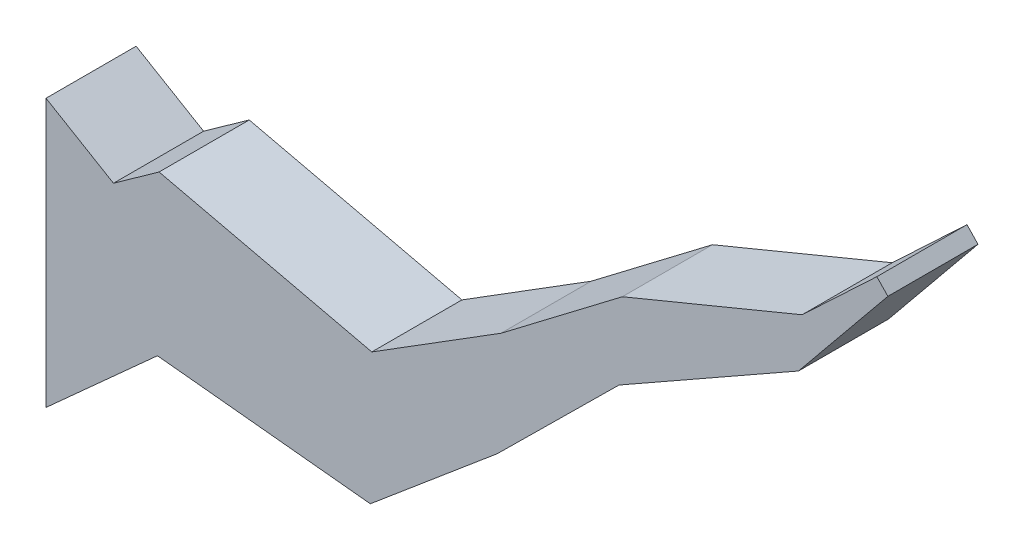
ISO-10303-21;
HEADER;
FILE_DESCRIPTION(('STEP AP214'),'2;1');
FILE_NAME('part.step','',(''),(''),'','','');
FILE_SCHEMA(('AUTOMOTIVE_DESIGN { 1 0 10303 214 1 1 1 1 }'));
ENDSEC;
DATA;
#1=APPLICATION_CONTEXT('core data for automotive mechanical design processes');
#2=APPLICATION_PROTOCOL_DEFINITION('international standard','automotive_design',2000,#1);
#3=PRODUCT_CONTEXT('',#1,'mechanical');
#4=PRODUCT('Part','Part','',(#3));
#5=PRODUCT_RELATED_PRODUCT_CATEGORY('part','',(#4));
#6=PRODUCT_DEFINITION_FORMATION('','',#4);
#7=PRODUCT_DEFINITION_CONTEXT('part definition',#1,'design');
#8=PRODUCT_DEFINITION('design','',#6,#7);
#9=PRODUCT_DEFINITION_SHAPE('','',#8);
#10=(LENGTH_UNIT() NAMED_UNIT(*) SI_UNIT(.MILLI.,.METRE.));
#11=(NAMED_UNIT(*) PLANE_ANGLE_UNIT() SI_UNIT($,.RADIAN.));
#12=(NAMED_UNIT(*) SI_UNIT($,.STERADIAN.) SOLID_ANGLE_UNIT());
#13=UNCERTAINTY_MEASURE_WITH_UNIT(LENGTH_MEASURE(1.E-05),#10,'distance_accuracy_value','');
#14=(GEOMETRIC_REPRESENTATION_CONTEXT(3) GLOBAL_UNCERTAINTY_ASSIGNED_CONTEXT((#13)) GLOBAL_UNIT_ASSIGNED_CONTEXT((#10,
#11,#12)) REPRESENTATION_CONTEXT('',''));
#15=CARTESIAN_POINT('',(0.,0.,0.));
#16=DIRECTION('',(0.,0.,1.));
#17=DIRECTION('',(1.,0.,0.));
#18=AXIS2_PLACEMENT_3D('',#15,#16,#17);
#19=CARTESIAN_POINT('',(28.1240717754824,17.4407213221905,3.));
#20=DIRECTION('',(-0.722292677122973,-0.691587513315942,0.));
#21=DIRECTION('',(0.691587513315942,-0.722292677122973,0.));
#22=AXIS2_PLACEMENT_3D('',#19,#20,#21);
#23=PLANE('',#22);
#24=DIRECTION('',(-0.691587513315942,0.722292677122973,0.));
#25=VECTOR('',#24,1.);
#26=CARTESIAN_POINT('',(28.1240717754824,17.4407213221905,0.));
#27=LINE('',#26,#25);
#28=CARTESIAN_POINT('',(28.1240717754824,17.4407213221905,0.));
#29=VERTEX_POINT('',#28);
#30=CARTESIAN_POINT('',(27.7572016130737,17.8238798186361,0.));
#31=VERTEX_POINT('',#30);
#32=EDGE_CURVE('E171',#29,#31,#27,.T.);
#33=ORIENTED_EDGE('',*,*,#32,.T.);
#34=DIRECTION('',(0.,0.,-1.));
#35=VECTOR('',#34,1.);
#36=CARTESIAN_POINT('',(27.7572016130737,17.8238798186361,3.));
#37=LINE('',#36,#35);
#38=CARTESIAN_POINT('',(27.7572016130737,17.8238798186361,3.));
#39=VERTEX_POINT('',#38);
#40=EDGE_CURVE('E11',#39,#31,#37,.T.);
#41=ORIENTED_EDGE('',*,*,#40,.F.);
#42=DIRECTION('',(-0.691587513315942,0.722292677122973,0.));
#43=VECTOR('',#42,1.);
#44=CARTESIAN_POINT('',(28.1240717754824,17.4407213221905,3.));
#45=LINE('',#44,#43);
#46=CARTESIAN_POINT('',(28.1240717754824,17.4407213221905,3.));
#47=VERTEX_POINT('',#46);
#48=EDGE_CURVE('E199',#47,#39,#45,.T.);
#49=ORIENTED_EDGE('',*,*,#48,.F.);
#50=DIRECTION('',(0.,0.,-1.));
#51=VECTOR('',#50,1.);
#52=CARTESIAN_POINT('',(28.1240717754824,17.4407213221905,3.));
#53=LINE('',#52,#51);
#54=EDGE_CURVE('E167',#47,#29,#53,.T.);
#55=ORIENTED_EDGE('',*,*,#54,.T.);
#56=EDGE_LOOP('',(#33,#41,#49,#55));
#57=FACE_BOUND('',#56,.T.);
#58=ADVANCED_FACE('F33',(#57),#23,.F.);
#59=CARTESIAN_POINT('',(27.7572016130737,17.8238798186361,3.));
#60=DIRECTION('',(0.685428367325739,-0.728140064318103,0.));
#61=DIRECTION('',(0.728140064318103,0.685428367325739,0.));
#62=AXIS2_PLACEMENT_3D('',#59,#60,#61);
#63=PLANE('',#62);
#64=DIRECTION('',(-0.728140064318103,-0.685428367325739,0.));
#65=VECTOR('',#64,1.);
#66=CARTESIAN_POINT('',(27.7572016130737,17.8238798186361,0.));
#67=LINE('',#66,#65);
#68=CARTESIAN_POINT('',(25.2694105764027,15.482019190338,0.));
#69=VERTEX_POINT('',#68);
#70=EDGE_CURVE('E174',#31,#69,#67,.T.);
#71=ORIENTED_EDGE('',*,*,#70,.T.);
#72=DIRECTION('',(0.,0.,-1.));
#73=VECTOR('',#72,1.);
#74=CARTESIAN_POINT('',(25.2694105764027,15.482019190338,3.));
#75=LINE('',#74,#73);
#76=CARTESIAN_POINT('',(25.2694105764027,15.482019190338,3.));
#77=VERTEX_POINT('',#76);
#78=EDGE_CURVE('E41',#77,#69,#75,.T.);
#79=ORIENTED_EDGE('',*,*,#78,.F.);
#80=DIRECTION('',(-0.728140064318103,-0.685428367325739,0.));
#81=VECTOR('',#80,1.);
#82=CARTESIAN_POINT('',(27.7572016130737,17.8238798186361,3.));
#83=LINE('',#82,#81);
#84=EDGE_CURVE('E113',#39,#77,#83,.T.);
#85=ORIENTED_EDGE('',*,*,#84,.F.);
#86=ORIENTED_EDGE('',*,*,#40,.T.);
#87=EDGE_LOOP('',(#71,#79,#85,#86));
#88=FACE_BOUND('',#87,.T.);
#89=ADVANCED_FACE('F292',(#88),#63,.F.);
#90=CARTESIAN_POINT('',(25.2694105764027,15.482019190338,3.));
#91=DIRECTION('',(0.381957868488228,-0.924179737226439,0.));
#92=DIRECTION('',(0.924179737226439,0.381957868488228,0.));
#93=AXIS2_PLACEMENT_3D('',#90,#91,#92);
#94=PLANE('',#93);
#95=DIRECTION('',(-0.924179737226439,-0.381957868488228,0.));
#96=VECTOR('',#95,1.);
#97=CARTESIAN_POINT('',(25.2694105764027,15.482019190338,0.));
#98=LINE('',#97,#96);
#99=CARTESIAN_POINT('',(19.2854038872218,13.0088655948282,0.));
#100=VERTEX_POINT('',#99);
#101=EDGE_CURVE('E176',#69,#100,#98,.T.);
#102=ORIENTED_EDGE('',*,*,#101,.T.);
#103=DIRECTION('',(0.,0.,-1.));
#104=VECTOR('',#103,1.);
#105=CARTESIAN_POINT('',(19.2854038872218,13.0088655948282,3.));
#106=LINE('',#105,#104);
#107=CARTESIAN_POINT('',(19.2854038872218,13.0088655948282,3.));
#108=VERTEX_POINT('',#107);
#109=EDGE_CURVE('E227',#108,#100,#106,.T.);
#110=ORIENTED_EDGE('',*,*,#109,.F.);
#111=DIRECTION('',(-0.924179737226439,-0.381957868488228,0.));
#112=VECTOR('',#111,1.);
#113=CARTESIAN_POINT('',(25.2694105764027,15.482019190338,3.));
#114=LINE('',#113,#112);
#115=EDGE_CURVE('E235',#77,#108,#114,.T.);
#116=ORIENTED_EDGE('',*,*,#115,.F.);
#117=ORIENTED_EDGE('',*,*,#78,.T.);
#118=EDGE_LOOP('',(#102,#110,#116,#117));
#119=FACE_BOUND('',#118,.T.);
#120=ADVANCED_FACE('F233',(#119),#94,.F.);
#121=CARTESIAN_POINT('',(19.2854038872218,13.0088655948282,3.));
#122=DIRECTION('',(0.605314490709016,-0.79598641152829,0.));
#123=DIRECTION('',(0.79598641152829,0.605314490709016,0.));
#124=AXIS2_PLACEMENT_3D('',#121,#122,#123);
#125=PLANE('',#124);
#126=DIRECTION('',(-0.79598641152829,-0.605314490709016,0.));
#127=VECTOR('',#126,1.);
#128=CARTESIAN_POINT('',(19.2854038872218,13.0088655948282,0.));
#129=LINE('',#128,#127);
#130=CARTESIAN_POINT('',(15.2467327608006,9.93762452761316,0.));
#131=VERTEX_POINT('',#130);
#132=EDGE_CURVE('E178',#100,#131,#129,.T.);
#133=ORIENTED_EDGE('',*,*,#132,.T.);
#134=DIRECTION('',(0.,0.,-1.));
#135=VECTOR('',#134,1.);
#136=CARTESIAN_POINT('',(15.2467327608006,9.93762452761316,3.));
#137=LINE('',#136,#135);
#138=CARTESIAN_POINT('',(15.2467327608006,9.93762452761316,3.));
#139=VERTEX_POINT('',#138);
#140=EDGE_CURVE('E224',#139,#131,#137,.T.);
#141=ORIENTED_EDGE('',*,*,#140,.F.);
#142=DIRECTION('',(-0.79598641152829,-0.605314490709016,0.));
#143=VECTOR('',#142,1.);
#144=CARTESIAN_POINT('',(19.2854038872218,13.0088655948282,3.));
#145=LINE('',#144,#143);
#146=EDGE_CURVE('E253',#108,#139,#145,.T.);
#147=ORIENTED_EDGE('',*,*,#146,.F.);
#148=ORIENTED_EDGE('',*,*,#109,.T.);
#149=EDGE_LOOP('',(#133,#141,#147,#148));
#150=FACE_BOUND('',#149,.T.);
#151=ADVANCED_FACE('F244',(#150),#125,.F.);
#152=CARTESIAN_POINT('',(15.2467327608006,9.93762452761316,3.));
#153=DIRECTION('',(0.530146678060812,-0.847905949820548,0.));
#154=DIRECTION('',(0.847905949820548,0.530146678060812,0.));
#155=AXIS2_PLACEMENT_3D('',#152,#153,#154);
#156=PLANE('',#155);
#157=DIRECTION('',(-0.847905949820548,-0.530146678060812,0.));
#158=VECTOR('',#157,1.);
#159=CARTESIAN_POINT('',(15.2467327608006,9.93762452761316,0.));
#160=LINE('',#159,#158);
#161=CARTESIAN_POINT('',(10.9450870959379,7.24805363840746,0.));
#162=VERTEX_POINT('',#161);
#163=EDGE_CURVE('E180',#131,#162,#160,.T.);
#164=ORIENTED_EDGE('',*,*,#163,.T.);
#165=DIRECTION('',(0.,0.,-1.));
#166=VECTOR('',#165,1.);
#167=CARTESIAN_POINT('',(10.9450870959379,7.24805363840746,3.));
#168=LINE('',#167,#166);
#169=CARTESIAN_POINT('',(10.9450870959379,7.24805363840746,3.));
#170=VERTEX_POINT('',#169);
#171=EDGE_CURVE('E221',#170,#162,#168,.T.);
#172=ORIENTED_EDGE('',*,*,#171,.F.);
#173=DIRECTION('',(-0.847905949820548,-0.530146678060812,0.));
#174=VECTOR('',#173,1.);
#175=CARTESIAN_POINT('',(15.2467327608006,9.93762452761316,3.));
#176=LINE('',#175,#174);
#177=EDGE_CURVE('E250',#139,#170,#176,.T.);
#178=ORIENTED_EDGE('',*,*,#177,.F.);
#179=ORIENTED_EDGE('',*,*,#140,.T.);
#180=EDGE_LOOP('',(#164,#172,#178,#179));
#181=FACE_BOUND('',#180,.T.);
#182=ADVANCED_FACE('F248',(#181),#156,.F.);
#183=CARTESIAN_POINT('',(10.9450870959379,7.24805363840746,3.));
#184=DIRECTION('',(-0.226614201134652,-0.973984601440959,0.));
#185=DIRECTION('',(0.973984601440959,-0.226614201134652,0.));
#186=AXIS2_PLACEMENT_3D('',#183,#184,#185);
#187=PLANE('',#186);
#188=DIRECTION('',(-0.973984601440959,0.226614201134652,0.));
#189=VECTOR('',#188,1.);
#190=CARTESIAN_POINT('',(10.9450870959379,7.24805363840746,0.));
#191=LINE('',#190,#189);
#192=CARTESIAN_POINT('',(3.86494846780942,8.8953691675875,0.));
#193=VERTEX_POINT('',#192);
#194=EDGE_CURVE('E182',#162,#193,#191,.T.);
#195=ORIENTED_EDGE('',*,*,#194,.T.);
#196=DIRECTION('',(0.,0.,-1.));
#197=VECTOR('',#196,1.);
#198=CARTESIAN_POINT('',(3.86494846780942,8.8953691675875,3.));
#199=LINE('',#198,#197);
#200=CARTESIAN_POINT('',(3.86494846780942,8.8953691675875,3.));
#201=VERTEX_POINT('',#200);
#202=EDGE_CURVE('E218',#201,#193,#199,.T.);
#203=ORIENTED_EDGE('',*,*,#202,.F.);
#204=DIRECTION('',(-0.973984601440959,0.226614201134652,0.));
#205=VECTOR('',#204,1.);
#206=CARTESIAN_POINT('',(10.9450870959379,7.24805363840746,3.));
#207=LINE('',#206,#205);
#208=EDGE_CURVE('E252',#170,#201,#207,.T.);
#209=ORIENTED_EDGE('',*,*,#208,.F.);
#210=ORIENTED_EDGE('',*,*,#171,.T.);
#211=EDGE_LOOP('',(#195,#203,#209,#210));
#212=FACE_BOUND('',#211,.T.);
#213=ADVANCED_FACE('F305',(#212),#187,.F.);
#214=CARTESIAN_POINT('',(3.86494846780942,8.8953691675875,3.));
#215=DIRECTION('',(0.580814461530031,-0.81403597050596,0.));
#216=DIRECTION('',(0.81403597050596,0.580814461530031,0.));
#217=AXIS2_PLACEMENT_3D('',#214,#215,#216);
#218=PLANE('',#217);
#219=DIRECTION('',(-0.81403597050596,-0.580814461530031,0.));
#220=VECTOR('',#219,1.);
#221=CARTESIAN_POINT('',(3.86494846780942,8.8953691675875,0.));
#222=LINE('',#221,#220);
#223=CARTESIAN_POINT('',(2.34613926449982,7.81169918057351,0.));
#224=VERTEX_POINT('',#223);
#225=EDGE_CURVE('E184',#193,#224,#222,.T.);
#226=ORIENTED_EDGE('',*,*,#225,.T.);
#227=DIRECTION('',(0.,0.,-1.));
#228=VECTOR('',#227,1.);
#229=CARTESIAN_POINT('',(2.34613926449982,7.81169918057351,3.));
#230=LINE('',#229,#228);
#231=CARTESIAN_POINT('',(2.34613926449982,7.81169918057351,3.));
#232=VERTEX_POINT('',#231);
#233=EDGE_CURVE('E215',#232,#224,#230,.T.);
#234=ORIENTED_EDGE('',*,*,#233,.F.);
#235=DIRECTION('',(-0.81403597050596,-0.580814461530031,0.));
#236=VECTOR('',#235,1.);
#237=CARTESIAN_POINT('',(3.86494846780942,8.8953691675875,3.));
#238=LINE('',#237,#236);
#239=EDGE_CURVE('E255',#201,#232,#238,.T.);
#240=ORIENTED_EDGE('',*,*,#239,.F.);
#241=ORIENTED_EDGE('',*,*,#202,.T.);
#242=EDGE_LOOP('',(#226,#234,#240,#241));
#243=FACE_BOUND('',#242,.T.);
#244=ADVANCED_FACE('F308',(#243),#218,.F.);
#245=CARTESIAN_POINT('',(2.34613926449982,7.81169918057351,3.));
#246=DIRECTION('',(-0.508789969816214,-0.860890682151001,0.));
#247=DIRECTION('',(0.860890682151001,-0.508789969816214,0.));
#248=AXIS2_PLACEMENT_3D('',#245,#246,#247);
#249=PLANE('',#248);
#250=DIRECTION('',(-0.860890682151001,0.508789969816214,0.));
#251=VECTOR('',#250,1.);
#252=CARTESIAN_POINT('',(2.34613926449982,7.81169918057351,0.));
#253=LINE('',#252,#251);
#254=CARTESIAN_POINT('',(0.1,9.13917681772539,0.));
#255=VERTEX_POINT('',#254);
#256=EDGE_CURVE('E186',#224,#255,#253,.T.);
#257=ORIENTED_EDGE('',*,*,#256,.T.);
#258=DIRECTION('',(0.,0.,-1.));
#259=VECTOR('',#258,1.);
#260=CARTESIAN_POINT('',(0.1,9.13917681772539,3.));
#261=LINE('',#260,#259);
#262=CARTESIAN_POINT('',(0.1,9.13917681772539,3.));
#263=VERTEX_POINT('',#262);
#264=EDGE_CURVE('E212',#263,#255,#261,.T.);
#265=ORIENTED_EDGE('',*,*,#264,.F.);
#266=DIRECTION('',(-0.860890682151001,0.508789969816214,0.));
#267=VECTOR('',#266,1.);
#268=CARTESIAN_POINT('',(2.34613926449982,7.81169918057351,3.));
#269=LINE('',#268,#267);
#270=EDGE_CURVE('E261',#232,#263,#269,.T.);
#271=ORIENTED_EDGE('',*,*,#270,.F.);
#272=ORIENTED_EDGE('',*,*,#233,.T.);
#273=EDGE_LOOP('',(#257,#265,#271,#272));
#274=FACE_BOUND('',#273,.T.);
#275=ADVANCED_FACE('F312',(#274),#249,.F.);
#276=CARTESIAN_POINT('',(0.1,9.13917681772539,3.));
#277=DIRECTION('',(1.,0.,0.));
#278=DIRECTION('',(0.,1.,0.));
#279=AXIS2_PLACEMENT_3D('',#276,#277,#278);
#280=PLANE('',#279);
#281=DIRECTION('',(0.,-1.,0.));
#282=VECTOR('',#281,1.);
#283=CARTESIAN_POINT('',(0.1,9.13917681772539,0.));
#284=LINE('',#283,#282);
#285=CARTESIAN_POINT('',(0.1,0.224829602908012,0.));
#286=VERTEX_POINT('',#285);
#287=EDGE_CURVE('E188',#255,#286,#284,.T.);
#288=ORIENTED_EDGE('',*,*,#287,.T.);
#289=DIRECTION('',(0.,0.,-1.));
#290=VECTOR('',#289,1.);
#291=CARTESIAN_POINT('',(0.1,0.224829602908012,3.));
#292=LINE('',#291,#290);
#293=CARTESIAN_POINT('',(0.1,0.224829602908012,3.));
#294=VERTEX_POINT('',#293);
#295=EDGE_CURVE('E209',#294,#286,#292,.T.);
#296=ORIENTED_EDGE('',*,*,#295,.F.);
#297=DIRECTION('',(0.,-1.,0.));
#298=VECTOR('',#297,1.);
#299=CARTESIAN_POINT('',(0.1,9.13917681772539,3.));
#300=LINE('',#299,#298);
#301=EDGE_CURVE('E263',#263,#294,#300,.T.);
#302=ORIENTED_EDGE('',*,*,#301,.F.);
#303=ORIENTED_EDGE('',*,*,#264,.T.);
#304=EDGE_LOOP('',(#288,#296,#302,#303));
#305=FACE_BOUND('',#304,.T.);
#306=ADVANCED_FACE('F316',(#305),#280,.F.);
#307=CARTESIAN_POINT('',(0.1,0.224829602908012,3.));
#308=DIRECTION('',(-0.669687921169614,0.742642638312345,0.));
#309=DIRECTION('',(-0.742642638312346,-0.669687921169614,0.));
#310=AXIS2_PLACEMENT_3D('',#307,#308,#309);
#311=PLANE('',#310);
#312=DIRECTION('',(0.742642638312346,0.669687921169614,0.));
#313=VECTOR('',#312,1.);
#314=CARTESIAN_POINT('',(0.1,0.224829602908012,0.));
#315=LINE('',#314,#313);
#316=CARTESIAN_POINT('',(3.80963392834032,3.57004156032546,0.));
#317=VERTEX_POINT('',#316);
#318=EDGE_CURVE('E190',#286,#317,#315,.T.);
#319=ORIENTED_EDGE('',*,*,#318,.T.);
#320=DIRECTION('',(0.,0.,-1.));
#321=VECTOR('',#320,1.);
#322=CARTESIAN_POINT('',(3.80963392834032,3.57004156032546,3.));
#323=LINE('',#322,#321);
#324=CARTESIAN_POINT('',(3.80963392834032,3.57004156032546,3.));
#325=VERTEX_POINT('',#324);
#326=EDGE_CURVE('E206',#325,#317,#323,.T.);
#327=ORIENTED_EDGE('',*,*,#326,.F.);
#328=DIRECTION('',(0.742642638312346,0.669687921169614,0.));
#329=VECTOR('',#328,1.);
#330=CARTESIAN_POINT('',(0.1,0.224829602908012,3.));
#331=LINE('',#330,#329);
#332=EDGE_CURVE('E265',#294,#325,#331,.T.);
#333=ORIENTED_EDGE('',*,*,#332,.F.);
#334=ORIENTED_EDGE('',*,*,#295,.T.);
#335=EDGE_LOOP('',(#319,#327,#333,#334));
#336=FACE_BOUND('',#335,.T.);
#337=ADVANCED_FACE('F320',(#336),#311,.F.);
#338=CARTESIAN_POINT('',(3.80963392834032,3.57004156032546,3.));
#339=DIRECTION('',(0.101794865063416,0.994805410845117,0.));
#340=DIRECTION('',(-0.994805410845117,0.101794865063416,0.));
#341=AXIS2_PLACEMENT_3D('',#338,#339,#340);
#342=PLANE('',#341);
#343=DIRECTION('',(0.994805410845117,-0.101794865063416,0.));
#344=VECTOR('',#343,1.);
#345=CARTESIAN_POINT('',(3.80963392834032,3.57004156032546,0.));
#346=LINE('',#345,#344);
#347=CARTESIAN_POINT('',(10.8953157660591,2.84498918456473,0.));
#348=VERTEX_POINT('',#347);
#349=EDGE_CURVE('E192',#317,#348,#346,.T.);
#350=ORIENTED_EDGE('',*,*,#349,.T.);
#351=DIRECTION('',(0.,0.,-1.));
#352=VECTOR('',#351,1.);
#353=CARTESIAN_POINT('',(10.8953157660591,2.84498918456473,3.));
#354=LINE('',#353,#352);
#355=CARTESIAN_POINT('',(10.8953157660591,2.84498918456473,3.));
#356=VERTEX_POINT('',#355);
#357=EDGE_CURVE('E203',#356,#348,#354,.T.);
#358=ORIENTED_EDGE('',*,*,#357,.F.);
#359=DIRECTION('',(0.994805410845117,-0.101794865063416,0.));
#360=VECTOR('',#359,1.);
#361=CARTESIAN_POINT('',(3.80963392834032,3.57004156032546,3.));
#362=LINE('',#361,#360);
#363=EDGE_CURVE('E267',#325,#356,#362,.T.);
#364=ORIENTED_EDGE('',*,*,#363,.F.);
#365=ORIENTED_EDGE('',*,*,#326,.T.);
#366=EDGE_LOOP('',(#350,#358,#364,#365));
#367=FACE_BOUND('',#366,.T.);
#368=ADVANCED_FACE('F273',(#367),#342,.F.);
#369=CARTESIAN_POINT('',(10.8953157660591,2.84498918456473,3.));
#370=DIRECTION('',(-0.643961936695433,0.765057529920114,0.));
#371=DIRECTION('',(-0.765057529920114,-0.643961936695433,0.));
#372=AXIS2_PLACEMENT_3D('',#369,#370,#371);
#373=PLANE('',#372);
#374=DIRECTION('',(0.765057529920114,0.643961936695433,0.));
#375=VECTOR('',#374,1.);
#376=CARTESIAN_POINT('',(10.8953157660591,2.84498918456473,0.));
#377=LINE('',#376,#375);
#378=CARTESIAN_POINT('',(15.122386476955,6.40298650513398,0.));
#379=VERTEX_POINT('',#378);
#380=EDGE_CURVE('E194',#348,#379,#377,.T.);
#381=ORIENTED_EDGE('',*,*,#380,.T.);
#382=DIRECTION('',(0.,0.,-1.));
#383=VECTOR('',#382,1.);
#384=CARTESIAN_POINT('',(15.122386476955,6.40298650513398,3.));
#385=LINE('',#384,#383);
#386=CARTESIAN_POINT('',(15.122386476955,6.40298650513398,3.));
#387=VERTEX_POINT('',#386);
#388=EDGE_CURVE('E162',#387,#379,#385,.T.);
#389=ORIENTED_EDGE('',*,*,#388,.F.);
#390=DIRECTION('',(0.765057529920114,0.643961936695433,0.));
#391=VECTOR('',#390,1.);
#392=CARTESIAN_POINT('',(10.8953157660591,2.84498918456473,3.));
#393=LINE('',#392,#391);
#394=EDGE_CURVE('E153',#356,#387,#393,.T.);
#395=ORIENTED_EDGE('',*,*,#394,.F.);
#396=ORIENTED_EDGE('',*,*,#357,.T.);
#397=EDGE_LOOP('',(#381,#389,#395,#396));
#398=FACE_BOUND('',#397,.T.);
#399=ADVANCED_FACE('F277',(#398),#373,.F.);
#400=CARTESIAN_POINT('',(15.122386476955,6.40298650513398,3.));
#401=DIRECTION('',(-0.702976099630869,0.711213472417228,0.));
#402=DIRECTION('',(-0.711213472417228,-0.702976099630869,0.));
#403=AXIS2_PLACEMENT_3D('',#400,#401,#402);
#404=PLANE('',#403);
#405=DIRECTION('',(0.711213472417228,0.702976099630868,0.));
#406=VECTOR('',#405,1.);
#407=CARTESIAN_POINT('',(15.122386476955,6.40298650513398,0.));
#408=LINE('',#407,#406);
#409=CARTESIAN_POINT('',(19.1743255018663,10.407995411944,0.));
#410=VERTEX_POINT('',#409);
#411=EDGE_CURVE('E161',#379,#410,#408,.T.);
#412=ORIENTED_EDGE('',*,*,#411,.T.);
#413=DIRECTION('',(0.,0.,-1.));
#414=VECTOR('',#413,1.);
#415=CARTESIAN_POINT('',(19.1743255018663,10.407995411944,3.));
#416=LINE('',#415,#414);
#417=CARTESIAN_POINT('',(19.1743255018663,10.407995411944,3.));
#418=VERTEX_POINT('',#417);
#419=EDGE_CURVE('E158',#418,#410,#416,.T.);
#420=ORIENTED_EDGE('',*,*,#419,.F.);
#421=DIRECTION('',(0.711213472417228,0.702976099630868,0.));
#422=VECTOR('',#421,1.);
#423=CARTESIAN_POINT('',(15.122386476955,6.40298650513398,3.));
#424=LINE('',#423,#422);
#425=EDGE_CURVE('E147',#387,#418,#424,.T.);
#426=ORIENTED_EDGE('',*,*,#425,.F.);
#427=ORIENTED_EDGE('',*,*,#388,.T.);
#428=EDGE_LOOP('',(#412,#420,#426,#427));
#429=FACE_BOUND('',#428,.T.);
#430=ADVANCED_FACE('F159',(#429),#404,.F.);
#431=CARTESIAN_POINT('',(19.1743255018663,10.407995411944,3.));
#432=DIRECTION('',(-0.493702410689097,0.869630915779662,0.));
#433=DIRECTION('',(-0.869630915779662,-0.493702410689097,0.));
#434=AXIS2_PLACEMENT_3D('',#431,#432,#433);
#435=PLANE('',#434);
#436=DIRECTION('',(0.869630915779662,0.493702410689097,0.));
#437=VECTOR('',#436,1.);
#438=CARTESIAN_POINT('',(19.1743255018663,10.407995411944,0.));
#439=LINE('',#438,#437);
#440=CARTESIAN_POINT('',(25.1486273954731,13.7996954924473,0.));
#441=VERTEX_POINT('',#440);
#442=EDGE_CURVE('E99',#410,#441,#439,.T.);
#443=ORIENTED_EDGE('',*,*,#442,.T.);
#444=DIRECTION('',(0.,0.,-1.));
#445=VECTOR('',#444,1.);
#446=CARTESIAN_POINT('',(25.1486273954731,13.7996954924473,3.));
#447=LINE('',#446,#445);
#448=CARTESIAN_POINT('',(25.1486273954731,13.7996954924473,3.));
#449=VERTEX_POINT('',#448);
#450=EDGE_CURVE('E163',#449,#441,#447,.T.);
#451=ORIENTED_EDGE('',*,*,#450,.F.);
#452=DIRECTION('',(0.869630915779662,0.493702410689097,0.));
#453=VECTOR('',#452,1.);
#454=CARTESIAN_POINT('',(19.1743255018663,10.407995411944,3.));
#455=LINE('',#454,#453);
#456=EDGE_CURVE('E151',#418,#449,#455,.T.);
#457=ORIENTED_EDGE('',*,*,#456,.F.);
#458=ORIENTED_EDGE('',*,*,#419,.T.);
#459=EDGE_LOOP('',(#443,#451,#457,#458));
#460=FACE_BOUND('',#459,.T.);
#461=ADVANCED_FACE('F165',(#460),#435,.F.);
#462=CARTESIAN_POINT('',(25.1486273954731,13.7996954924473,3.));
#463=DIRECTION('',(-0.774329964417423,0.632782036885776,0.));
#464=DIRECTION('',(-0.632782036885776,-0.774329964417423,0.));
#465=AXIS2_PLACEMENT_3D('',#462,#463,#464);
#466=PLANE('',#465);
#467=DIRECTION('',(0.632782036885776,0.774329964417423,0.));
#468=VECTOR('',#467,1.);
#469=CARTESIAN_POINT('',(25.1486273954731,13.7996954924473,0.));
#470=LINE('',#469,#468);
#471=EDGE_CURVE('E105',#441,#29,#470,.T.);
#472=ORIENTED_EDGE('',*,*,#471,.T.);
#473=ORIENTED_EDGE('',*,*,#54,.F.);
#474=DIRECTION('',(0.632782036885776,0.774329964417423,0.));
#475=VECTOR('',#474,1.);
#476=CARTESIAN_POINT('',(25.1486273954731,13.7996954924473,3.));
#477=LINE('',#476,#475);
#478=EDGE_CURVE('E49',#449,#47,#477,.T.);
#479=ORIENTED_EDGE('',*,*,#478,.F.);
#480=ORIENTED_EDGE('',*,*,#450,.T.);
#481=EDGE_LOOP('',(#472,#473,#479,#480));
#482=FACE_BOUND('',#481,.T.);
#483=ADVANCED_FACE('F281',(#482),#466,.F.);
#484=CARTESIAN_POINT('',(0.,0.,3.));
#485=DIRECTION('',(0.,0.,1.));
#486=DIRECTION('',(1.,0.,0.));
#487=AXIS2_PLACEMENT_3D('',#484,#485,#486);
#488=PLANE('',#487);
#489=ORIENTED_EDGE('',*,*,#48,.T.);
#490=ORIENTED_EDGE('',*,*,#84,.T.);
#491=ORIENTED_EDGE('',*,*,#115,.T.);
#492=ORIENTED_EDGE('',*,*,#146,.T.);
#493=ORIENTED_EDGE('',*,*,#177,.T.);
#494=ORIENTED_EDGE('',*,*,#208,.T.);
#495=ORIENTED_EDGE('',*,*,#239,.T.);
#496=ORIENTED_EDGE('',*,*,#270,.T.);
#497=ORIENTED_EDGE('',*,*,#301,.T.);
#498=ORIENTED_EDGE('',*,*,#332,.T.);
#499=ORIENTED_EDGE('',*,*,#363,.T.);
#500=ORIENTED_EDGE('',*,*,#394,.T.);
#501=ORIENTED_EDGE('',*,*,#425,.T.);
#502=ORIENTED_EDGE('',*,*,#456,.T.);
#503=ORIENTED_EDGE('',*,*,#478,.T.);
#504=EDGE_LOOP('',(#489,#490,#491,#492,#493,#494,#495,#496,#497,#498,#499,#500,#501,#502,#503));
#505=FACE_BOUND('',#504,.T.);
#506=ADVANCED_FACE('F149',(#505),#488,.T.);
#507=CARTESIAN_POINT('',(0.,0.,0.));
#508=DIRECTION('',(0.,0.,1.));
#509=DIRECTION('',(1.,0.,0.));
#510=AXIS2_PLACEMENT_3D('',#507,#508,#509);
#511=PLANE('',#510);
#512=ORIENTED_EDGE('',*,*,#32,.F.);
#513=ORIENTED_EDGE('',*,*,#471,.F.);
#514=ORIENTED_EDGE('',*,*,#442,.F.);
#515=ORIENTED_EDGE('',*,*,#411,.F.);
#516=ORIENTED_EDGE('',*,*,#380,.F.);
#517=ORIENTED_EDGE('',*,*,#349,.F.);
#518=ORIENTED_EDGE('',*,*,#318,.F.);
#519=ORIENTED_EDGE('',*,*,#287,.F.);
#520=ORIENTED_EDGE('',*,*,#256,.F.);
#521=ORIENTED_EDGE('',*,*,#225,.F.);
#522=ORIENTED_EDGE('',*,*,#194,.F.);
#523=ORIENTED_EDGE('',*,*,#163,.F.);
#524=ORIENTED_EDGE('',*,*,#132,.F.);
#525=ORIENTED_EDGE('',*,*,#101,.F.);
#526=ORIENTED_EDGE('',*,*,#70,.F.);
#527=EDGE_LOOP('',(#512,#513,#514,#515,#516,#517,#518,#519,#520,#521,#522,#523,#524,#525,#526));
#528=FACE_BOUND('',#527,.T.);
#529=ADVANCED_FACE('F239',(#528),#511,.F.);
#530=CLOSED_SHELL('',(#58,#89,#120,#151,#182,#213,#244,#275,#306,#337,#368,#399,#430,#461,#483,
#506,#529));
#531=MANIFOLD_SOLID_BREP('B2',#530);
#532=ADVANCED_BREP_SHAPE_REPRESENTATION('',(#18,#531),#14);
#533=SHAPE_DEFINITION_REPRESENTATION(#9,#532);
ENDSEC;
END-ISO-10303-21;
